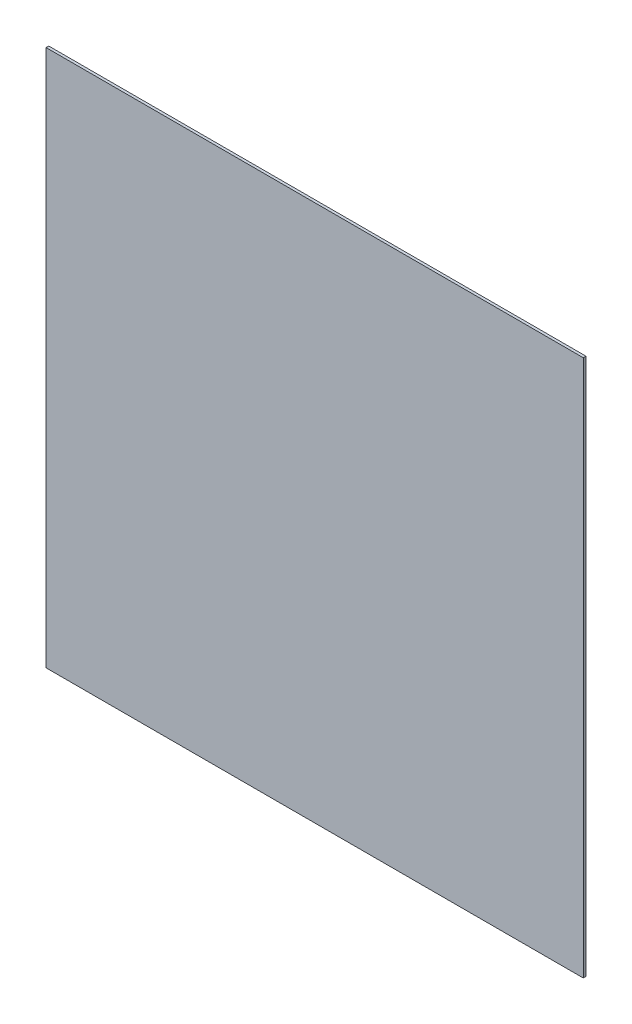
ISO-10303-21;
HEADER;
FILE_DESCRIPTION(('STEP AP214'),'2;1');
FILE_NAME('part.step','',(''),(''),'','','');
FILE_SCHEMA(('AUTOMOTIVE_DESIGN { 1 0 10303 214 1 1 1 1 }'));
ENDSEC;
DATA;
#1=APPLICATION_CONTEXT('core data for automotive mechanical design processes');
#2=APPLICATION_PROTOCOL_DEFINITION('international standard','automotive_design',2000,#1);
#3=PRODUCT_CONTEXT('',#1,'mechanical');
#4=PRODUCT('Part','Part','',(#3));
#5=PRODUCT_RELATED_PRODUCT_CATEGORY('part','',(#4));
#6=PRODUCT_DEFINITION_FORMATION('','',#4);
#7=PRODUCT_DEFINITION_CONTEXT('part definition',#1,'design');
#8=PRODUCT_DEFINITION('design','',#6,#7);
#9=PRODUCT_DEFINITION_SHAPE('','',#8);
#10=(LENGTH_UNIT() NAMED_UNIT(*) SI_UNIT(.MILLI.,.METRE.));
#11=(NAMED_UNIT(*) PLANE_ANGLE_UNIT() SI_UNIT($,.RADIAN.));
#12=(NAMED_UNIT(*) SI_UNIT($,.STERADIAN.) SOLID_ANGLE_UNIT());
#13=UNCERTAINTY_MEASURE_WITH_UNIT(LENGTH_MEASURE(1.E-05),#10,'distance_accuracy_value','');
#14=(GEOMETRIC_REPRESENTATION_CONTEXT(3) GLOBAL_UNCERTAINTY_ASSIGNED_CONTEXT((#13)) GLOBAL_UNIT_ASSIGNED_CONTEXT((#10,
#11,#12)) REPRESENTATION_CONTEXT('',''));
#15=CARTESIAN_POINT('',(0.,0.,0.));
#16=DIRECTION('',(0.,0.,1.));
#17=DIRECTION('',(1.,0.,0.));
#18=AXIS2_PLACEMENT_3D('',#15,#16,#17);
#19=CARTESIAN_POINT('',(-400.,-400.,4.));
#20=DIRECTION('',(1.,0.,0.));
#21=DIRECTION('',(0.,0.,-1.));
#22=AXIS2_PLACEMENT_3D('',#19,#20,#21);
#23=PLANE('',#22);
#24=DIRECTION('',(0.,-1.,0.));
#25=VECTOR('',#24,1.);
#26=CARTESIAN_POINT('',(-400.,-400.,0.));
#27=LINE('',#26,#25);
#28=CARTESIAN_POINT('',(-400.,400.,0.));
#29=VERTEX_POINT('',#28);
#30=CARTESIAN_POINT('',(-400.,-400.,0.));
#31=VERTEX_POINT('',#30);
#32=EDGE_CURVE('E98',#29,#31,#27,.T.);
#33=ORIENTED_EDGE('',*,*,#32,.T.);
#34=DIRECTION('',(0.,0.,-1.));
#35=VECTOR('',#34,1.);
#36=CARTESIAN_POINT('',(-400.,-400.,4.));
#37=LINE('',#36,#35);
#38=CARTESIAN_POINT('',(-400.,-400.,4.));
#39=VERTEX_POINT('',#38);
#40=EDGE_CURVE('E11',#39,#31,#37,.T.);
#41=ORIENTED_EDGE('',*,*,#40,.F.);
#42=DIRECTION('',(0.,-1.,0.));
#43=VECTOR('',#42,1.);
#44=CARTESIAN_POINT('',(-400.,-400.,4.));
#45=LINE('',#44,#43);
#46=CARTESIAN_POINT('',(-400.,400.,4.));
#47=VERTEX_POINT('',#46);
#48=EDGE_CURVE('E86',#47,#39,#45,.T.);
#49=ORIENTED_EDGE('',*,*,#48,.F.);
#50=DIRECTION('',(0.,0.,-1.));
#51=VECTOR('',#50,1.);
#52=CARTESIAN_POINT('',(-400.,400.,4.));
#53=LINE('',#52,#51);
#54=EDGE_CURVE('E94',#47,#29,#53,.T.);
#55=ORIENTED_EDGE('',*,*,#54,.T.);
#56=EDGE_LOOP('',(#33,#41,#49,#55));
#57=FACE_BOUND('',#56,.T.);
#58=ADVANCED_FACE('F35',(#57),#23,.F.);
#59=CARTESIAN_POINT('',(400.,-400.,4.));
#60=DIRECTION('',(0.,1.,0.));
#61=DIRECTION('',(-1.,0.,0.));
#62=AXIS2_PLACEMENT_3D('',#59,#60,#61);
#63=PLANE('',#62);
#64=DIRECTION('',(1.,0.,0.));
#65=VECTOR('',#64,1.);
#66=CARTESIAN_POINT('',(400.,-400.,0.));
#67=LINE('',#66,#65);
#68=CARTESIAN_POINT('',(400.,-400.,0.));
#69=VERTEX_POINT('',#68);
#70=EDGE_CURVE('E90',#31,#69,#67,.T.);
#71=ORIENTED_EDGE('',*,*,#70,.T.);
#72=DIRECTION('',(0.,0.,-1.));
#73=VECTOR('',#72,1.);
#74=CARTESIAN_POINT('',(400.,-400.,4.));
#75=LINE('',#74,#73);
#76=CARTESIAN_POINT('',(400.,-400.,4.));
#77=VERTEX_POINT('',#76);
#78=EDGE_CURVE('E43',#77,#69,#75,.T.);
#79=ORIENTED_EDGE('',*,*,#78,.F.);
#80=DIRECTION('',(1.,0.,0.));
#81=VECTOR('',#80,1.);
#82=CARTESIAN_POINT('',(400.,-400.,4.));
#83=LINE('',#82,#81);
#84=EDGE_CURVE('E81',#39,#77,#83,.T.);
#85=ORIENTED_EDGE('',*,*,#84,.F.);
#86=ORIENTED_EDGE('',*,*,#40,.T.);
#87=EDGE_LOOP('',(#71,#79,#85,#86));
#88=FACE_BOUND('',#87,.T.);
#89=ADVANCED_FACE('F89',(#88),#63,.F.);
#90=CARTESIAN_POINT('',(400.,-400.,4.));
#91=DIRECTION('',(-1.,0.,0.));
#92=DIRECTION('',(0.,0.,1.));
#93=AXIS2_PLACEMENT_3D('',#90,#91,#92);
#94=PLANE('',#93);
#95=DIRECTION('',(0.,1.,0.));
#96=VECTOR('',#95,1.);
#97=CARTESIAN_POINT('',(400.,-400.,0.));
#98=LINE('',#97,#96);
#99=CARTESIAN_POINT('',(400.,400.,0.));
#100=VERTEX_POINT('',#99);
#101=EDGE_CURVE('E68',#69,#100,#98,.T.);
#102=ORIENTED_EDGE('',*,*,#101,.T.);
#103=DIRECTION('',(0.,0.,-1.));
#104=VECTOR('',#103,1.);
#105=CARTESIAN_POINT('',(400.,400.,4.));
#106=LINE('',#105,#104);
#107=CARTESIAN_POINT('',(400.,400.,4.));
#108=VERTEX_POINT('',#107);
#109=EDGE_CURVE('E91',#108,#100,#106,.T.);
#110=ORIENTED_EDGE('',*,*,#109,.F.);
#111=DIRECTION('',(0.,1.,0.));
#112=VECTOR('',#111,1.);
#113=CARTESIAN_POINT('',(400.,-400.,4.));
#114=LINE('',#113,#112);
#115=EDGE_CURVE('E84',#77,#108,#114,.T.);
#116=ORIENTED_EDGE('',*,*,#115,.F.);
#117=ORIENTED_EDGE('',*,*,#78,.T.);
#118=EDGE_LOOP('',(#102,#110,#116,#117));
#119=FACE_BOUND('',#118,.T.);
#120=ADVANCED_FACE('F92',(#119),#94,.F.);
#121=CARTESIAN_POINT('',(400.,400.,4.));
#122=DIRECTION('',(0.,-1.,0.));
#123=DIRECTION('',(1.,0.,0.));
#124=AXIS2_PLACEMENT_3D('',#121,#122,#123);
#125=PLANE('',#124);
#126=DIRECTION('',(-1.,0.,0.));
#127=VECTOR('',#126,1.);
#128=CARTESIAN_POINT('',(400.,400.,0.));
#129=LINE('',#128,#127);
#130=EDGE_CURVE('E74',#100,#29,#129,.T.);
#131=ORIENTED_EDGE('',*,*,#130,.T.);
#132=ORIENTED_EDGE('',*,*,#54,.F.);
#133=DIRECTION('',(-1.,0.,0.));
#134=VECTOR('',#133,1.);
#135=CARTESIAN_POINT('',(400.,400.,4.));
#136=LINE('',#135,#134);
#137=EDGE_CURVE('E51',#108,#47,#136,.T.);
#138=ORIENTED_EDGE('',*,*,#137,.F.);
#139=ORIENTED_EDGE('',*,*,#109,.T.);
#140=EDGE_LOOP('',(#131,#132,#138,#139));
#141=FACE_BOUND('',#140,.T.);
#142=ADVANCED_FACE('F105',(#141),#125,.F.);
#143=CARTESIAN_POINT('',(0.,0.,4.));
#144=DIRECTION('',(0.,0.,1.));
#145=DIRECTION('',(1.,0.,0.));
#146=AXIS2_PLACEMENT_3D('',#143,#144,#145);
#147=PLANE('',#146);
#148=ORIENTED_EDGE('',*,*,#48,.T.);
#149=ORIENTED_EDGE('',*,*,#84,.T.);
#150=ORIENTED_EDGE('',*,*,#115,.T.);
#151=ORIENTED_EDGE('',*,*,#137,.T.);
#152=EDGE_LOOP('',(#148,#149,#150,#151));
#153=FACE_BOUND('',#152,.T.);
#154=ADVANCED_FACE('F82',(#153),#147,.T.);
#155=CARTESIAN_POINT('',(0.,0.,0.));
#156=DIRECTION('',(0.,0.,1.));
#157=DIRECTION('',(1.,0.,0.));
#158=AXIS2_PLACEMENT_3D('',#155,#156,#157);
#159=PLANE('',#158);
#160=ORIENTED_EDGE('',*,*,#32,.F.);
#161=ORIENTED_EDGE('',*,*,#130,.F.);
#162=ORIENTED_EDGE('',*,*,#101,.F.);
#163=ORIENTED_EDGE('',*,*,#70,.F.);
#164=EDGE_LOOP('',(#160,#161,#162,#163));
#165=FACE_BOUND('',#164,.T.);
#166=ADVANCED_FACE('F108',(#165),#159,.F.);
#167=CLOSED_SHELL('',(#58,#89,#120,#142,#154,#166));
#168=MANIFOLD_SOLID_BREP('B2',#167);
#169=ADVANCED_BREP_SHAPE_REPRESENTATION('',(#18,#168),#14);
#170=SHAPE_DEFINITION_REPRESENTATION(#9,#169);
ENDSEC;
END-ISO-10303-21;
